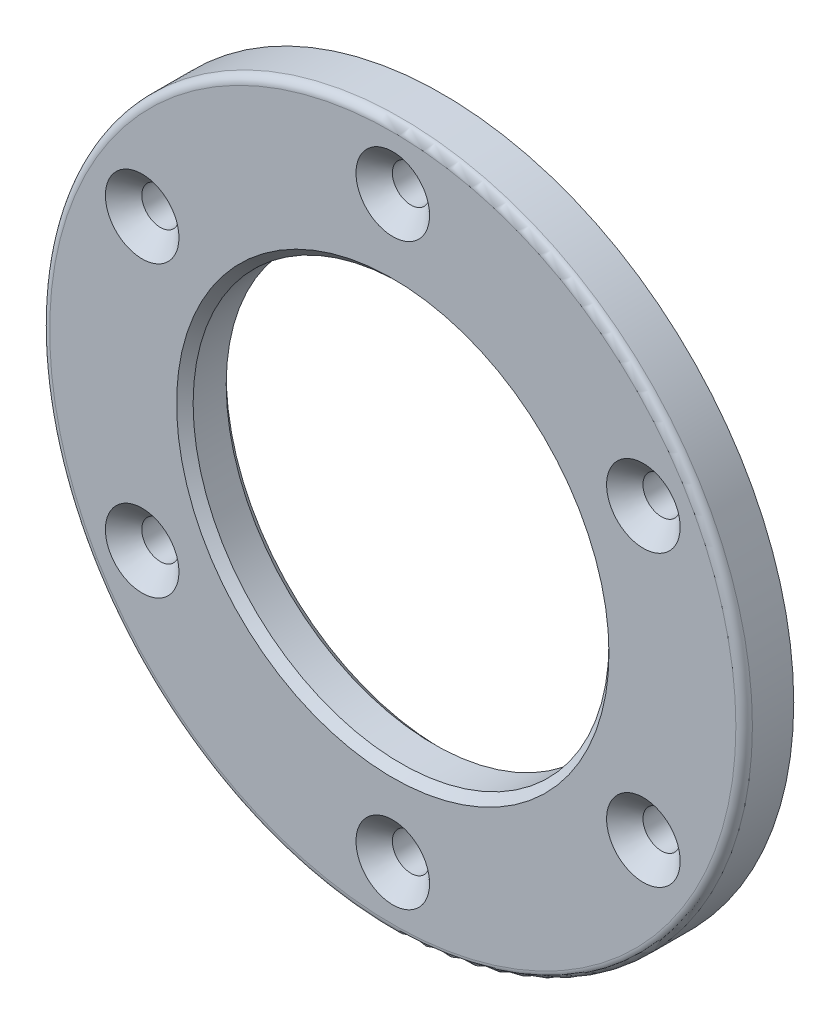
ISO-10303-21;
HEADER;
FILE_DESCRIPTION(('STEP AP214'),'2;1');
FILE_NAME('part.step','',(''),(''),'','','');
FILE_SCHEMA(('AUTOMOTIVE_DESIGN { 1 0 10303 214 1 1 1 1 }'));
ENDSEC;
DATA;
#1=APPLICATION_CONTEXT('core data for automotive mechanical design processes');
#2=APPLICATION_PROTOCOL_DEFINITION('international standard','automotive_design',2000,#1);
#3=PRODUCT_CONTEXT('',#1,'mechanical');
#4=PRODUCT('Part','Part','',(#3));
#5=PRODUCT_RELATED_PRODUCT_CATEGORY('part','',(#4));
#6=PRODUCT_DEFINITION_FORMATION('','',#4);
#7=PRODUCT_DEFINITION_CONTEXT('part definition',#1,'design');
#8=PRODUCT_DEFINITION('design','',#6,#7);
#9=PRODUCT_DEFINITION_SHAPE('','',#8);
#10=(LENGTH_UNIT() NAMED_UNIT(*) SI_UNIT(.MILLI.,.METRE.));
#11=(NAMED_UNIT(*) PLANE_ANGLE_UNIT() SI_UNIT($,.RADIAN.));
#12=(NAMED_UNIT(*) SI_UNIT($,.STERADIAN.) SOLID_ANGLE_UNIT());
#13=UNCERTAINTY_MEASURE_WITH_UNIT(LENGTH_MEASURE(1.E-05),#10,'distance_accuracy_value','');
#14=(GEOMETRIC_REPRESENTATION_CONTEXT(3) GLOBAL_UNCERTAINTY_ASSIGNED_CONTEXT((#13)) GLOBAL_UNIT_ASSIGNED_CONTEXT((#10,
#11,#12)) REPRESENTATION_CONTEXT('',''));
#15=CARTESIAN_POINT('',(0.,0.,0.));
#16=DIRECTION('',(0.,0.,1.));
#17=DIRECTION('',(1.,0.,0.));
#18=AXIS2_PLACEMENT_3D('',#15,#16,#17);
#19=CARTESIAN_POINT('',(0.,0.,6.));
#20=DIRECTION('',(0.,0.,-1.));
#21=DIRECTION('',(-1.,0.,0.));
#22=AXIS2_PLACEMENT_3D('',#19,#20,#21);
#23=CYLINDRICAL_SURFACE('',#22,42.5);
#24=CARTESIAN_POINT('',(0.,0.,5.));
#25=DIRECTION('',(0.,0.,1.));
#26=DIRECTION('',(1.,0.,0.));
#27=AXIS2_PLACEMENT_3D('',#24,#25,#26);
#28=CIRCLE('',#27,42.5);
#29=CARTESIAN_POINT('',(42.5,0.,5.));
#30=VERTEX_POINT('',#29);
#31=EDGE_CURVE('E10',#30,#30,#28,.F.);
#32=ORIENTED_EDGE('',*,*,#31,.T.);
#33=EDGE_LOOP('',(#32));
#34=FACE_BOUND('',#33,.T.);
#35=CARTESIAN_POINT('',(0.,0.,0.));
#36=DIRECTION('',(0.,0.,1.));
#37=DIRECTION('',(1.,0.,0.));
#38=AXIS2_PLACEMENT_3D('',#35,#36,#37);
#39=CIRCLE('',#38,42.5);
#40=CARTESIAN_POINT('',(42.5,0.,0.));
#41=VERTEX_POINT('',#40);
#42=EDGE_CURVE('E121',#41,#41,#39,.T.);
#43=ORIENTED_EDGE('',*,*,#42,.T.);
#44=EDGE_LOOP('',(#43));
#45=FACE_BOUND('',#44,.T.);
#46=ADVANCED_FACE('F41',(#34,#45),#23,.T.);
#47=CARTESIAN_POINT('',(0.,0.,6.));
#48=DIRECTION('',(0.,0.,1.));
#49=DIRECTION('',(1.,0.,0.));
#50=AXIS2_PLACEMENT_3D('',#47,#48,#49);
#51=PLANE('',#50);
#52=CARTESIAN_POINT('',(0.,0.,6.));
#53=DIRECTION('',(0.,0.,1.));
#54=DIRECTION('',(1.,0.,0.));
#55=AXIS2_PLACEMENT_3D('',#52,#53,#54);
#56=CIRCLE('',#55,41.5);
#57=CARTESIAN_POINT('',(41.5,0.,6.));
#58=VERTEX_POINT('',#57);
#59=EDGE_CURVE('E49',#58,#58,#56,.T.);
#60=ORIENTED_EDGE('',*,*,#59,.T.);
#61=EDGE_LOOP('',(#60));
#62=FACE_BOUND('',#61,.T.);
#63=CARTESIAN_POINT('',(0.,0.,6.));
#64=DIRECTION('',(0.,0.,1.));
#65=DIRECTION('',(1.,0.,0.));
#66=AXIS2_PLACEMENT_3D('',#63,#64,#65);
#67=CIRCLE('',#66,26.15);
#68=CARTESIAN_POINT('',(26.15,0.,6.));
#69=VERTEX_POINT('',#68);
#70=EDGE_CURVE('E54',#69,#69,#67,.F.);
#71=ORIENTED_EDGE('',*,*,#70,.T.);
#72=EDGE_LOOP('',(#71));
#73=FACE_BOUND('',#72,.T.);
#74=CARTESIAN_POINT('',(-30.3108891324552,17.5000000000004,6.));
#75=DIRECTION('',(0.,0.,1.));
#76=DIRECTION('',(1.,0.,0.));
#77=AXIS2_PLACEMENT_3D('',#74,#75,#76);
#78=CIRCLE('',#77,4.45000000000008);
#79=CARTESIAN_POINT('',(-25.8608891324551,17.5000000000004,6.));
#80=VERTEX_POINT('',#79);
#81=EDGE_CURVE('E73',#80,#80,#78,.F.);
#82=ORIENTED_EDGE('',*,*,#81,.T.);
#83=EDGE_LOOP('',(#82));
#84=FACE_BOUND('',#83,.T.);
#85=CARTESIAN_POINT('',(-30.3108891324555,-17.4999999999997,6.));
#86=DIRECTION('',(0.,0.,1.));
#87=DIRECTION('',(1.,0.,0.));
#88=AXIS2_PLACEMENT_3D('',#85,#86,#87);
#89=CIRCLE('',#88,4.45000000000004);
#90=CARTESIAN_POINT('',(-25.8608891324555,-17.4999999999997,6.));
#91=VERTEX_POINT('',#90);
#92=EDGE_CURVE('E81',#91,#91,#89,.F.);
#93=ORIENTED_EDGE('',*,*,#92,.T.);
#94=EDGE_LOOP('',(#93));
#95=FACE_BOUND('',#94,.T.);
#96=CARTESIAN_POINT('',(0.,-35.,6.));
#97=DIRECTION('',(0.,0.,1.));
#98=DIRECTION('',(1.,0.,0.));
#99=AXIS2_PLACEMENT_3D('',#96,#97,#98);
#100=CIRCLE('',#99,4.45000000000004);
#101=CARTESIAN_POINT('',(4.45000000000004,-35.,6.));
#102=VERTEX_POINT('',#101);
#103=EDGE_CURVE('E89',#102,#102,#100,.F.);
#104=ORIENTED_EDGE('',*,*,#103,.T.);
#105=EDGE_LOOP('',(#104));
#106=FACE_BOUND('',#105,.T.);
#107=CARTESIAN_POINT('',(30.3108891324553,-17.5000000000001,6.));
#108=DIRECTION('',(0.,0.,1.));
#109=DIRECTION('',(1.,0.,0.));
#110=AXIS2_PLACEMENT_3D('',#107,#108,#109);
#111=CIRCLE('',#110,4.45000000000005);
#112=CARTESIAN_POINT('',(34.7608891324553,-17.5000000000001,6.));
#113=VERTEX_POINT('',#112);
#114=EDGE_CURVE('E97',#113,#113,#111,.F.);
#115=ORIENTED_EDGE('',*,*,#114,.T.);
#116=EDGE_LOOP('',(#115));
#117=FACE_BOUND('',#116,.T.);
#118=CARTESIAN_POINT('',(30.3108891324554,17.4999999999999,6.));
#119=DIRECTION('',(0.,0.,1.));
#120=DIRECTION('',(1.,0.,0.));
#121=AXIS2_PLACEMENT_3D('',#118,#119,#120);
#122=CIRCLE('',#121,4.45000000000004);
#123=CARTESIAN_POINT('',(34.7608891324554,17.4999999999999,6.));
#124=VERTEX_POINT('',#123);
#125=EDGE_CURVE('E105',#124,#124,#122,.F.);
#126=ORIENTED_EDGE('',*,*,#125,.T.);
#127=EDGE_LOOP('',(#126));
#128=FACE_BOUND('',#127,.T.);
#129=CARTESIAN_POINT('',(0.,35.,6.));
#130=DIRECTION('',(0.,0.,1.));
#131=DIRECTION('',(1.,0.,0.));
#132=AXIS2_PLACEMENT_3D('',#129,#130,#131);
#133=CIRCLE('',#132,4.45000000000004);
#134=CARTESIAN_POINT('',(4.45000000000004,35.,6.));
#135=VERTEX_POINT('',#134);
#136=EDGE_CURVE('E113',#135,#135,#133,.F.);
#137=ORIENTED_EDGE('',*,*,#136,.T.);
#138=EDGE_LOOP('',(#137));
#139=FACE_BOUND('',#138,.T.);
#140=ADVANCED_FACE('F170',(#62,#73,#84,#95,#106,#117,#128,#139),#51,.T.);
#141=CARTESIAN_POINT('',(0.,0.,0.));
#142=DIRECTION('',(0.,0.,1.));
#143=DIRECTION('',(1.,0.,0.));
#144=AXIS2_PLACEMENT_3D('',#141,#142,#143);
#145=PLANE('',#144);
#146=CARTESIAN_POINT('',(0.,0.,0.));
#147=DIRECTION('',(0.,0.,1.));
#148=DIRECTION('',(1.,0.,0.));
#149=AXIS2_PLACEMENT_3D('',#146,#147,#148);
#150=CIRCLE('',#149,26.15);
#151=CARTESIAN_POINT('',(26.15,0.,0.));
#152=VERTEX_POINT('',#151);
#153=EDGE_CURVE('E69',#152,#152,#150,.T.);
#154=ORIENTED_EDGE('',*,*,#153,.T.);
#155=EDGE_LOOP('',(#154));
#156=FACE_BOUND('',#155,.T.);
#157=CARTESIAN_POINT('',(-30.3108891324552,17.5000000000004,0.));
#158=DIRECTION('',(0.,0.,1.));
#159=DIRECTION('',(0.50000000000001,0.866025403784433,0.));
#160=AXIS2_PLACEMENT_3D('',#157,#158,#159);
#161=CIRCLE('',#160,2.25);
#162=CARTESIAN_POINT('',(-29.1858891324551,19.4485571585153,0.));
#163=VERTEX_POINT('',#162);
#164=EDGE_CURVE('E134',#163,#163,#161,.T.);
#165=ORIENTED_EDGE('',*,*,#164,.T.);
#166=EDGE_LOOP('',(#165));
#167=FACE_BOUND('',#166,.T.);
#168=CARTESIAN_POINT('',(-30.3108891324555,-17.4999999999997,0.));
#169=DIRECTION('',(0.,0.,1.));
#170=DIRECTION('',(-0.499999999999992,0.866025403784443,0.));
#171=AXIS2_PLACEMENT_3D('',#168,#169,#170);
#172=CIRCLE('',#171,2.25);
#173=CARTESIAN_POINT('',(-31.4358891324555,-15.5514428414847,0.));
#174=VERTEX_POINT('',#173);
#175=EDGE_CURVE('E138',#174,#174,#172,.T.);
#176=ORIENTED_EDGE('',*,*,#175,.T.);
#177=EDGE_LOOP('',(#176));
#178=FACE_BOUND('',#177,.T.);
#179=CARTESIAN_POINT('',(0.,-35.,0.));
#180=DIRECTION('',(0.,0.,1.));
#181=DIRECTION('',(-1.,0.,0.));
#182=AXIS2_PLACEMENT_3D('',#179,#180,#181);
#183=CIRCLE('',#182,2.25);
#184=CARTESIAN_POINT('',(-2.25,-35.,0.));
#185=VERTEX_POINT('',#184);
#186=EDGE_CURVE('E142',#185,#185,#183,.T.);
#187=ORIENTED_EDGE('',*,*,#186,.T.);
#188=EDGE_LOOP('',(#187));
#189=FACE_BOUND('',#188,.T.);
#190=CARTESIAN_POINT('',(30.3108891324553,-17.5000000000001,0.));
#191=DIRECTION('',(0.,0.,1.));
#192=DIRECTION('',(-0.500000000000004,-0.866025403784436,0.));
#193=AXIS2_PLACEMENT_3D('',#190,#191,#192);
#194=CIRCLE('',#193,2.25);
#195=CARTESIAN_POINT('',(29.1858891324553,-19.4485571585151,0.));
#196=VERTEX_POINT('',#195);
#197=EDGE_CURVE('E133',#196,#196,#194,.T.);
#198=ORIENTED_EDGE('',*,*,#197,.T.);
#199=EDGE_LOOP('',(#198));
#200=FACE_BOUND('',#199,.T.);
#201=CARTESIAN_POINT('',(30.3108891324554,17.4999999999999,0.));
#202=DIRECTION('',(0.,0.,1.));
#203=DIRECTION('',(0.499999999999998,-0.86602540378444,0.));
#204=AXIS2_PLACEMENT_3D('',#201,#202,#203);
#205=CIRCLE('',#204,2.25);
#206=CARTESIAN_POINT('',(31.4358891324554,15.5514428414849,0.));
#207=VERTEX_POINT('',#206);
#208=EDGE_CURVE('E129',#207,#207,#205,.T.);
#209=ORIENTED_EDGE('',*,*,#208,.T.);
#210=EDGE_LOOP('',(#209));
#211=FACE_BOUND('',#210,.T.);
#212=CARTESIAN_POINT('',(0.,35.,0.));
#213=DIRECTION('',(0.,0.,1.));
#214=DIRECTION('',(1.,0.,0.));
#215=AXIS2_PLACEMENT_3D('',#212,#213,#214);
#216=CIRCLE('',#215,2.25);
#217=CARTESIAN_POINT('',(2.25,35.,0.));
#218=VERTEX_POINT('',#217);
#219=EDGE_CURVE('E125',#218,#218,#216,.T.);
#220=ORIENTED_EDGE('',*,*,#219,.T.);
#221=EDGE_LOOP('',(#220));
#222=FACE_BOUND('',#221,.T.);
#223=ORIENTED_EDGE('',*,*,#42,.F.);
#224=EDGE_LOOP('',(#223));
#225=FACE_BOUND('',#224,.T.);
#226=ADVANCED_FACE('F150',(#156,#167,#178,#189,#200,#211,#222,#225),#145,.F.);
#227=CARTESIAN_POINT('',(0.,0.,0.));
#228=DIRECTION('',(0.,0.,1.));
#229=DIRECTION('',(1.,0.,0.));
#230=AXIS2_PLACEMENT_3D('',#227,#228,#229);
#231=CYLINDRICAL_SURFACE('',#230,25.15);
#232=CARTESIAN_POINT('',(0.,0.,1.00000000000001));
#233=DIRECTION('',(0.,0.,1.));
#234=DIRECTION('',(1.,0.,0.));
#235=AXIS2_PLACEMENT_3D('',#232,#233,#234);
#236=CIRCLE('',#235,25.15);
#237=CARTESIAN_POINT('',(25.15,0.,1.00000000000001));
#238=VERTEX_POINT('',#237);
#239=EDGE_CURVE('E59',#238,#238,#236,.F.);
#240=ORIENTED_EDGE('',*,*,#239,.T.);
#241=EDGE_LOOP('',(#240));
#242=FACE_BOUND('',#241,.T.);
#243=CARTESIAN_POINT('',(0.,0.,4.99999999999997));
#244=DIRECTION('',(0.,0.,1.));
#245=DIRECTION('',(1.,0.,0.));
#246=AXIS2_PLACEMENT_3D('',#243,#244,#245);
#247=CIRCLE('',#246,25.15);
#248=CARTESIAN_POINT('',(25.15,0.,4.99999999999997));
#249=VERTEX_POINT('',#248);
#250=EDGE_CURVE('E65',#249,#249,#247,.T.);
#251=ORIENTED_EDGE('',*,*,#250,.T.);
#252=EDGE_LOOP('',(#251));
#253=FACE_BOUND('',#252,.T.);
#254=ADVANCED_FACE('F242',(#242,#253),#231,.F.);
#255=CARTESIAN_POINT('',(0.,35.,0.));
#256=DIRECTION('',(0.,0.,1.));
#257=DIRECTION('',(1.,0.,0.));
#258=AXIS2_PLACEMENT_3D('',#255,#256,#257);
#259=CYLINDRICAL_SURFACE('',#258,2.25);
#260=CARTESIAN_POINT('',(0.,35.,3.79999999999997));
#261=DIRECTION('',(0.,0.,1.));
#262=DIRECTION('',(1.,0.,0.));
#263=AXIS2_PLACEMENT_3D('',#260,#261,#262);
#264=CIRCLE('',#263,2.25);
#265=CARTESIAN_POINT('',(2.25,35.,3.79999999999997));
#266=VERTEX_POINT('',#265);
#267=EDGE_CURVE('E117',#266,#266,#264,.T.);
#268=ORIENTED_EDGE('',*,*,#267,.T.);
#269=EDGE_LOOP('',(#268));
#270=FACE_BOUND('',#269,.T.);
#271=ORIENTED_EDGE('',*,*,#219,.F.);
#272=EDGE_LOOP('',(#271));
#273=FACE_BOUND('',#272,.T.);
#274=ADVANCED_FACE('F185',(#270,#273),#259,.F.);
#275=CARTESIAN_POINT('',(0.,35.,3.79999999999997));
#276=DIRECTION('',(0.,0.,1.));
#277=DIRECTION('',(1.,0.,0.));
#278=AXIS2_PLACEMENT_3D('',#275,#276,#277);
#279=CONICAL_SURFACE('',#278,2.25,0.78539816339745);
#280=ORIENTED_EDGE('',*,*,#136,.F.);
#281=EDGE_LOOP('',(#280));
#282=FACE_BOUND('',#281,.T.);
#283=ORIENTED_EDGE('',*,*,#267,.F.);
#284=EDGE_LOOP('',(#283));
#285=FACE_BOUND('',#284,.T.);
#286=ADVANCED_FACE('F166',(#282,#285),#279,.F.);
#287=CARTESIAN_POINT('',(30.3108891324554,17.4999999999999,0.));
#288=DIRECTION('',(0.,0.,1.));
#289=DIRECTION('',(1.,0.,0.));
#290=AXIS2_PLACEMENT_3D('',#287,#288,#289);
#291=CYLINDRICAL_SURFACE('',#290,2.25);
#292=CARTESIAN_POINT('',(30.3108891324554,17.4999999999999,3.79999999999997));
#293=DIRECTION('',(0.,0.,1.));
#294=DIRECTION('',(1.,0.,0.));
#295=AXIS2_PLACEMENT_3D('',#292,#293,#294);
#296=CIRCLE('',#295,2.25);
#297=CARTESIAN_POINT('',(32.5608891324554,17.4999999999999,3.79999999999997));
#298=VERTEX_POINT('',#297);
#299=EDGE_CURVE('E109',#298,#298,#296,.T.);
#300=ORIENTED_EDGE('',*,*,#299,.T.);
#301=EDGE_LOOP('',(#300));
#302=FACE_BOUND('',#301,.T.);
#303=ORIENTED_EDGE('',*,*,#208,.F.);
#304=EDGE_LOOP('',(#303));
#305=FACE_BOUND('',#304,.T.);
#306=ADVANCED_FACE('F156',(#302,#305),#291,.F.);
#307=CARTESIAN_POINT('',(30.3108891324553,-17.5000000000001,0.));
#308=DIRECTION('',(0.,0.,1.));
#309=DIRECTION('',(1.,0.,0.));
#310=AXIS2_PLACEMENT_3D('',#307,#308,#309);
#311=CYLINDRICAL_SURFACE('',#310,2.25);
#312=CARTESIAN_POINT('',(30.3108891324553,-17.5000000000001,3.79999999999997));
#313=DIRECTION('',(0.,0.,1.));
#314=DIRECTION('',(1.,0.,0.));
#315=AXIS2_PLACEMENT_3D('',#312,#313,#314);
#316=CIRCLE('',#315,2.25);
#317=CARTESIAN_POINT('',(32.5608891324553,-17.5000000000001,3.79999999999997));
#318=VERTEX_POINT('',#317);
#319=EDGE_CURVE('E101',#318,#318,#316,.T.);
#320=ORIENTED_EDGE('',*,*,#319,.T.);
#321=EDGE_LOOP('',(#320));
#322=FACE_BOUND('',#321,.T.);
#323=ORIENTED_EDGE('',*,*,#197,.F.);
#324=EDGE_LOOP('',(#323));
#325=FACE_BOUND('',#324,.T.);
#326=ADVANCED_FACE('F153',(#322,#325),#311,.F.);
#327=CARTESIAN_POINT('',(0.,-35.,0.));
#328=DIRECTION('',(0.,0.,1.));
#329=DIRECTION('',(1.,0.,0.));
#330=AXIS2_PLACEMENT_3D('',#327,#328,#329);
#331=CYLINDRICAL_SURFACE('',#330,2.25);
#332=CARTESIAN_POINT('',(0.,-35.,3.79999999999997));
#333=DIRECTION('',(0.,0.,1.));
#334=DIRECTION('',(1.,0.,0.));
#335=AXIS2_PLACEMENT_3D('',#332,#333,#334);
#336=CIRCLE('',#335,2.25);
#337=CARTESIAN_POINT('',(2.25,-35.,3.79999999999997));
#338=VERTEX_POINT('',#337);
#339=EDGE_CURVE('E93',#338,#338,#336,.T.);
#340=ORIENTED_EDGE('',*,*,#339,.T.);
#341=EDGE_LOOP('',(#340));
#342=FACE_BOUND('',#341,.T.);
#343=ORIENTED_EDGE('',*,*,#186,.F.);
#344=EDGE_LOOP('',(#343));
#345=FACE_BOUND('',#344,.T.);
#346=ADVANCED_FACE('F155',(#342,#345),#331,.F.);
#347=CARTESIAN_POINT('',(-30.3108891324555,-17.4999999999997,0.));
#348=DIRECTION('',(0.,0.,1.));
#349=DIRECTION('',(1.,0.,0.));
#350=AXIS2_PLACEMENT_3D('',#347,#348,#349);
#351=CYLINDRICAL_SURFACE('',#350,2.25);
#352=CARTESIAN_POINT('',(-30.3108891324555,-17.4999999999997,3.79999999999997));
#353=DIRECTION('',(0.,0.,1.));
#354=DIRECTION('',(1.,0.,0.));
#355=AXIS2_PLACEMENT_3D('',#352,#353,#354);
#356=CIRCLE('',#355,2.25);
#357=CARTESIAN_POINT('',(-28.0608891324555,-17.4999999999997,3.79999999999997));
#358=VERTEX_POINT('',#357);
#359=EDGE_CURVE('E85',#358,#358,#356,.T.);
#360=ORIENTED_EDGE('',*,*,#359,.T.);
#361=EDGE_LOOP('',(#360));
#362=FACE_BOUND('',#361,.T.);
#363=ORIENTED_EDGE('',*,*,#175,.F.);
#364=EDGE_LOOP('',(#363));
#365=FACE_BOUND('',#364,.T.);
#366=ADVANCED_FACE('F163',(#362,#365),#351,.F.);
#367=CARTESIAN_POINT('',(-30.3108891324552,17.5000000000004,0.));
#368=DIRECTION('',(0.,0.,1.));
#369=DIRECTION('',(1.,0.,0.));
#370=AXIS2_PLACEMENT_3D('',#367,#368,#369);
#371=CYLINDRICAL_SURFACE('',#370,2.25);
#372=CARTESIAN_POINT('',(-30.3108891324552,17.5000000000004,3.79999999999994));
#373=DIRECTION('',(0.,0.,1.));
#374=DIRECTION('',(1.,0.,0.));
#375=AXIS2_PLACEMENT_3D('',#372,#373,#374);
#376=CIRCLE('',#375,2.25);
#377=CARTESIAN_POINT('',(-28.0608891324551,17.5000000000004,3.79999999999994));
#378=VERTEX_POINT('',#377);
#379=EDGE_CURVE('E77',#378,#378,#376,.T.);
#380=ORIENTED_EDGE('',*,*,#379,.T.);
#381=EDGE_LOOP('',(#380));
#382=FACE_BOUND('',#381,.T.);
#383=ORIENTED_EDGE('',*,*,#164,.F.);
#384=EDGE_LOOP('',(#383));
#385=FACE_BOUND('',#384,.T.);
#386=ADVANCED_FACE('F194',(#382,#385),#371,.F.);
#387=CARTESIAN_POINT('',(30.3108891324554,17.4999999999999,3.79999999999997));
#388=DIRECTION('',(0.,0.,1.));
#389=DIRECTION('',(1.,0.,0.));
#390=AXIS2_PLACEMENT_3D('',#387,#388,#389);
#391=CONICAL_SURFACE('',#390,2.25,0.785398163397449);
#392=ORIENTED_EDGE('',*,*,#125,.F.);
#393=EDGE_LOOP('',(#392));
#394=FACE_BOUND('',#393,.T.);
#395=ORIENTED_EDGE('',*,*,#299,.F.);
#396=EDGE_LOOP('',(#395));
#397=FACE_BOUND('',#396,.T.);
#398=ADVANCED_FACE('F187',(#394,#397),#391,.F.);
#399=CARTESIAN_POINT('',(30.3108891324553,-17.5000000000001,3.79999999999997));
#400=DIRECTION('',(0.,0.,1.));
#401=DIRECTION('',(1.,0.,0.));
#402=AXIS2_PLACEMENT_3D('',#399,#400,#401);
#403=CONICAL_SURFACE('',#402,2.25,0.785398163397451);
#404=ORIENTED_EDGE('',*,*,#114,.F.);
#405=EDGE_LOOP('',(#404));
#406=FACE_BOUND('',#405,.T.);
#407=ORIENTED_EDGE('',*,*,#319,.F.);
#408=EDGE_LOOP('',(#407));
#409=FACE_BOUND('',#408,.T.);
#410=ADVANCED_FACE('F193',(#406,#409),#403,.F.);
#411=CARTESIAN_POINT('',(0.,-35.,3.79999999999997));
#412=DIRECTION('',(0.,0.,1.));
#413=DIRECTION('',(1.,0.,0.));
#414=AXIS2_PLACEMENT_3D('',#411,#412,#413);
#415=CONICAL_SURFACE('',#414,2.25,0.78539816339745);
#416=ORIENTED_EDGE('',*,*,#103,.F.);
#417=EDGE_LOOP('',(#416));
#418=FACE_BOUND('',#417,.T.);
#419=ORIENTED_EDGE('',*,*,#339,.F.);
#420=EDGE_LOOP('',(#419));
#421=FACE_BOUND('',#420,.T.);
#422=ADVANCED_FACE('F201',(#418,#421),#415,.F.);
#423=CARTESIAN_POINT('',(-30.3108891324555,-17.4999999999997,3.79999999999997));
#424=DIRECTION('',(0.,0.,1.));
#425=DIRECTION('',(1.,0.,0.));
#426=AXIS2_PLACEMENT_3D('',#423,#424,#425);
#427=CONICAL_SURFACE('',#426,2.25,0.785398163397451);
#428=ORIENTED_EDGE('',*,*,#92,.F.);
#429=EDGE_LOOP('',(#428));
#430=FACE_BOUND('',#429,.T.);
#431=ORIENTED_EDGE('',*,*,#359,.F.);
#432=EDGE_LOOP('',(#431));
#433=FACE_BOUND('',#432,.T.);
#434=ADVANCED_FACE('F208',(#430,#433),#427,.F.);
#435=CARTESIAN_POINT('',(-30.3108891324552,17.5000000000004,3.79999999999994));
#436=DIRECTION('',(0.,0.,1.));
#437=DIRECTION('',(1.,0.,0.));
#438=AXIS2_PLACEMENT_3D('',#435,#436,#437);
#439=CONICAL_SURFACE('',#438,2.25,0.785398163397453);
#440=ORIENTED_EDGE('',*,*,#81,.F.);
#441=EDGE_LOOP('',(#440));
#442=FACE_BOUND('',#441,.T.);
#443=ORIENTED_EDGE('',*,*,#379,.F.);
#444=EDGE_LOOP('',(#443));
#445=FACE_BOUND('',#444,.T.);
#446=ADVANCED_FACE('F215',(#442,#445),#439,.F.);
#447=CARTESIAN_POINT('',(0.,0.,0.));
#448=DIRECTION('',(0.,0.,-1.));
#449=DIRECTION('',(-1.,0.,0.));
#450=AXIS2_PLACEMENT_3D('',#447,#448,#449);
#451=CONICAL_SURFACE('',#450,26.15,0.785398163397448);
#452=ORIENTED_EDGE('',*,*,#239,.F.);
#453=EDGE_LOOP('',(#452));
#454=FACE_BOUND('',#453,.T.);
#455=ORIENTED_EDGE('',*,*,#153,.F.);
#456=EDGE_LOOP('',(#455));
#457=FACE_BOUND('',#456,.T.);
#458=ADVANCED_FACE('F222',(#454,#457),#451,.F.);
#459=CARTESIAN_POINT('',(0.,0.,4.99999999999997));
#460=DIRECTION('',(0.,0.,1.));
#461=DIRECTION('',(1.,0.,0.));
#462=AXIS2_PLACEMENT_3D('',#459,#460,#461);
#463=CONICAL_SURFACE('',#462,25.15,0.78539816339745);
#464=ORIENTED_EDGE('',*,*,#70,.F.);
#465=EDGE_LOOP('',(#464));
#466=FACE_BOUND('',#465,.T.);
#467=ORIENTED_EDGE('',*,*,#250,.F.);
#468=EDGE_LOOP('',(#467));
#469=FACE_BOUND('',#468,.T.);
#470=ADVANCED_FACE('F228',(#466,#469),#463,.F.);
#471=CARTESIAN_POINT('',(0.,0.,5.));
#472=DIRECTION('',(0.,0.,1.));
#473=DIRECTION('',(1.,0.,0.));
#474=AXIS2_PLACEMENT_3D('',#471,#472,#473);
#475=TOROIDAL_SURFACE('',#474,41.5,1.);
#476=ORIENTED_EDGE('',*,*,#31,.F.);
#477=EDGE_LOOP('',(#476));
#478=FACE_BOUND('',#477,.T.);
#479=ORIENTED_EDGE('',*,*,#59,.F.);
#480=EDGE_LOOP('',(#479));
#481=FACE_BOUND('',#480,.T.);
#482=ADVANCED_FACE('F43',(#478,#481),#475,.T.);
#483=CLOSED_SHELL('',(#46,#140,#226,#254,#274,#286,#306,#326,#346,#366,#386,#398,#410,#422,#434,
#446,#458,#470,#482));
#484=MANIFOLD_SOLID_BREP('B2',#483);
#485=ADVANCED_BREP_SHAPE_REPRESENTATION('',(#18,#484),#14);
#486=SHAPE_DEFINITION_REPRESENTATION(#9,#485);
ENDSEC;
END-ISO-10303-21;
